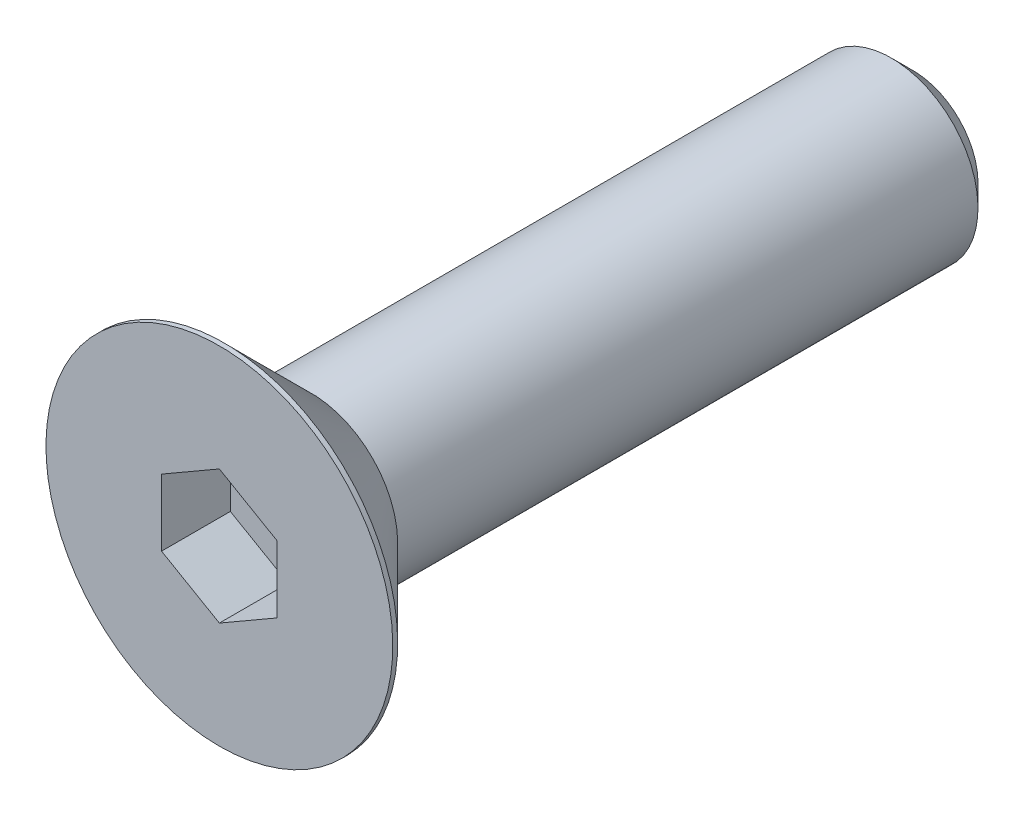
ISO-10303-21;
HEADER;
FILE_DESCRIPTION(('STEP AP214'),'2;1');
FILE_NAME('part.step','',(''),(''),'','','');
FILE_SCHEMA(('AUTOMOTIVE_DESIGN { 1 0 10303 214 1 1 1 1 }'));
ENDSEC;
DATA;
#1=APPLICATION_CONTEXT('core data for automotive mechanical design processes');
#2=APPLICATION_PROTOCOL_DEFINITION('international standard','automotive_design',2000,#1);
#3=PRODUCT_CONTEXT('',#1,'mechanical');
#4=PRODUCT('Part','Part','',(#3));
#5=PRODUCT_RELATED_PRODUCT_CATEGORY('part','',(#4));
#6=PRODUCT_DEFINITION_FORMATION('','',#4);
#7=PRODUCT_DEFINITION_CONTEXT('part definition',#1,'design');
#8=PRODUCT_DEFINITION('design','',#6,#7);
#9=PRODUCT_DEFINITION_SHAPE('','',#8);
#10=(LENGTH_UNIT() NAMED_UNIT(*) SI_UNIT(.MILLI.,.METRE.));
#11=(NAMED_UNIT(*) PLANE_ANGLE_UNIT() SI_UNIT($,.RADIAN.));
#12=(NAMED_UNIT(*) SI_UNIT($,.STERADIAN.) SOLID_ANGLE_UNIT());
#13=UNCERTAINTY_MEASURE_WITH_UNIT(LENGTH_MEASURE(1.E-05),#10,'distance_accuracy_value','');
#14=(GEOMETRIC_REPRESENTATION_CONTEXT(3) GLOBAL_UNCERTAINTY_ASSIGNED_CONTEXT((#13)) GLOBAL_UNIT_ASSIGNED_CONTEXT((#10,
#11,#12)) REPRESENTATION_CONTEXT('',''));
#15=CARTESIAN_POINT('',(0.,0.,0.));
#16=DIRECTION('',(0.,0.,1.));
#17=DIRECTION('',(1.,0.,0.));
#18=AXIS2_PLACEMENT_3D('',#15,#16,#17);
#19=CARTESIAN_POINT('',(0.,0.,5.915));
#20=DIRECTION('',(0.,0.,1.));
#21=DIRECTION('',(0.,-1.,0.));
#22=AXIS2_PLACEMENT_3D('',#19,#20,#21);
#23=CONICAL_SURFACE('',#22,3.,0.785398163397448);
#24=CARTESIAN_POINT('',(0.,0.,4.3));
#25=DIRECTION('',(0.,0.,1.));
#26=DIRECTION('',(0.,-1.,0.));
#27=AXIS2_PLACEMENT_3D('',#24,#25,#26);
#28=CIRCLE('',#27,1.385);
#29=CARTESIAN_POINT('',(0.,-1.385,4.3));
#30=VERTEX_POINT('',#29);
#31=EDGE_CURVE('E150',#30,#30,#28,.T.);
#32=ORIENTED_EDGE('',*,*,#31,.T.);
#33=EDGE_LOOP('',(#32));
#34=FACE_BOUND('',#33,.T.);
#35=CARTESIAN_POINT('',(0.,0.,5.915));
#36=DIRECTION('',(0.,0.,1.));
#37=DIRECTION('',(0.,-1.,0.));
#38=AXIS2_PLACEMENT_3D('',#35,#36,#37);
#39=CIRCLE('',#38,3.);
#40=CARTESIAN_POINT('',(0.,-3.,5.915));
#41=VERTEX_POINT('',#40);
#42=EDGE_CURVE('E12',#41,#41,#39,.T.);
#43=ORIENTED_EDGE('',*,*,#42,.F.);
#44=EDGE_LOOP('',(#43));
#45=FACE_BOUND('',#44,.T.);
#46=ADVANCED_FACE('F49',(#34,#45),#23,.T.);
#47=CARTESIAN_POINT('',(0.,0.,6.));
#48=DIRECTION('',(0.,0.,1.));
#49=DIRECTION('',(0.,-1.,0.));
#50=AXIS2_PLACEMENT_3D('',#47,#48,#49);
#51=CYLINDRICAL_SURFACE('',#50,3.);
#52=ORIENTED_EDGE('',*,*,#42,.T.);
#53=EDGE_LOOP('',(#52));
#54=FACE_BOUND('',#53,.T.);
#55=CARTESIAN_POINT('',(0.,0.,6.));
#56=DIRECTION('',(0.,0.,1.));
#57=DIRECTION('',(0.,-1.,0.));
#58=AXIS2_PLACEMENT_3D('',#55,#56,#57);
#59=CIRCLE('',#58,3.);
#60=CARTESIAN_POINT('',(0.,-3.,6.));
#61=VERTEX_POINT('',#60);
#62=EDGE_CURVE('E56',#61,#61,#59,.T.);
#63=ORIENTED_EDGE('',*,*,#62,.F.);
#64=EDGE_LOOP('',(#63));
#65=FACE_BOUND('',#64,.T.);
#66=ADVANCED_FACE('F162',(#54,#65),#51,.T.);
#67=CARTESIAN_POINT('',(0.,0.,6.));
#68=DIRECTION('',(0.,0.,-1.));
#69=DIRECTION('',(0.,1.,0.));
#70=AXIS2_PLACEMENT_3D('',#67,#68,#69);
#71=PLANE('',#70);
#72=DIRECTION('',(0.,1.,0.));
#73=VECTOR('',#72,1.);
#74=CARTESIAN_POINT('',(1.,-0.577350269189627,6.));
#75=LINE('',#74,#73);
#76=CARTESIAN_POINT('',(1.,-0.577350269189627,6.));
#77=VERTEX_POINT('',#76);
#78=CARTESIAN_POINT('',(1.,0.577350269189625,6.));
#79=VERTEX_POINT('',#78);
#80=EDGE_CURVE('E137',#77,#79,#75,.T.);
#81=ORIENTED_EDGE('',*,*,#80,.F.);
#82=DIRECTION('',(0.866025403784438,0.5,0.));
#83=VECTOR('',#82,1.);
#84=CARTESIAN_POINT('',(0.,-1.15470053837926,6.));
#85=LINE('',#84,#83);
#86=CARTESIAN_POINT('',(0.,-1.15470053837926,6.));
#87=VERTEX_POINT('',#86);
#88=EDGE_CURVE('E63',#87,#77,#85,.T.);
#89=ORIENTED_EDGE('',*,*,#88,.F.);
#90=DIRECTION('',(0.866025403784439,-0.5,0.));
#91=VECTOR('',#90,1.);
#92=CARTESIAN_POINT('',(-1.,-0.577350269189629,6.));
#93=LINE('',#92,#91);
#94=CARTESIAN_POINT('',(-1.,-0.577350269189629,6.));
#95=VERTEX_POINT('',#94);
#96=EDGE_CURVE('E146',#95,#87,#93,.T.);
#97=ORIENTED_EDGE('',*,*,#96,.F.);
#98=DIRECTION('',(0.,-1.,0.));
#99=VECTOR('',#98,1.);
#100=CARTESIAN_POINT('',(-1.,0.577350269189624,6.));
#101=LINE('',#100,#99);
#102=CARTESIAN_POINT('',(-1.,0.577350269189624,6.));
#103=VERTEX_POINT('',#102);
#104=EDGE_CURVE('E144',#103,#95,#101,.T.);
#105=ORIENTED_EDGE('',*,*,#104,.F.);
#106=DIRECTION('',(-0.866025403784438,-0.5,0.));
#107=VECTOR('',#106,1.);
#108=CARTESIAN_POINT('',(0.,1.15470053837925,6.));
#109=LINE('',#108,#107);
#110=CARTESIAN_POINT('',(0.,1.15470053837925,6.));
#111=VERTEX_POINT('',#110);
#112=EDGE_CURVE('E111',#111,#103,#109,.T.);
#113=ORIENTED_EDGE('',*,*,#112,.F.);
#114=DIRECTION('',(-0.866025403784439,0.5,0.));
#115=VECTOR('',#114,1.);
#116=CARTESIAN_POINT('',(1.,0.577350269189625,6.));
#117=LINE('',#116,#115);
#118=EDGE_CURVE('E140',#79,#111,#117,.T.);
#119=ORIENTED_EDGE('',*,*,#118,.F.);
#120=EDGE_LOOP('',(#81,#89,#97,#105,#113,#119));
#121=FACE_BOUND('',#120,.T.);
#122=ORIENTED_EDGE('',*,*,#62,.T.);
#123=EDGE_LOOP('',(#122));
#124=FACE_BOUND('',#123,.T.);
#125=ADVANCED_FACE('F160',(#121,#124),#71,.F.);
#126=CARTESIAN_POINT('',(0.,0.,4.3));
#127=DIRECTION('',(0.,0.,-1.));
#128=DIRECTION('',(0.,1.,0.));
#129=AXIS2_PLACEMENT_3D('',#126,#127,#128);
#130=PLANE('',#129);
#131=ORIENTED_EDGE('',*,*,#31,.F.);
#132=EDGE_LOOP('',(#131));
#133=FACE_BOUND('',#132,.T.);
#134=ADVANCED_FACE('F169',(#133),#130,.T.);
#135=CARTESIAN_POINT('',(0.,-1.15470053837926,4.81));
#136=DIRECTION('',(0.5,-0.866025403784438,0.));
#137=DIRECTION('',(0.866025403784439,0.5,0.));
#138=AXIS2_PLACEMENT_3D('',#135,#136,#137);
#139=PLANE('',#138);
#140=ORIENTED_EDGE('',*,*,#88,.T.);
#141=DIRECTION('',(0.,0.,1.));
#142=VECTOR('',#141,1.);
#143=CARTESIAN_POINT('',(1.,-0.577350269189627,4.81));
#144=LINE('',#143,#142);
#145=CARTESIAN_POINT('',(1.,-0.577350269189627,4.81));
#146=VERTEX_POINT('',#145);
#147=EDGE_CURVE('E93',#146,#77,#144,.T.);
#148=ORIENTED_EDGE('',*,*,#147,.F.);
#149=DIRECTION('',(0.866025403784438,0.5,0.));
#150=VECTOR('',#149,1.);
#151=CARTESIAN_POINT('',(0.,-1.15470053837926,4.81));
#152=LINE('',#151,#150);
#153=CARTESIAN_POINT('',(0.,-1.15470053837926,4.81));
#154=VERTEX_POINT('',#153);
#155=EDGE_CURVE('E148',#154,#146,#152,.T.);
#156=ORIENTED_EDGE('',*,*,#155,.F.);
#157=DIRECTION('',(0.,0.,1.));
#158=VECTOR('',#157,1.);
#159=CARTESIAN_POINT('',(0.,-1.15470053837926,4.81));
#160=LINE('',#159,#158);
#161=EDGE_CURVE('E71',#154,#87,#160,.T.);
#162=ORIENTED_EDGE('',*,*,#161,.T.);
#163=EDGE_LOOP('',(#140,#148,#156,#162));
#164=FACE_BOUND('',#163,.T.);
#165=ADVANCED_FACE('F176',(#164),#139,.F.);
#166=CARTESIAN_POINT('',(-1.,-0.577350269189629,4.81));
#167=DIRECTION('',(-0.5,-0.866025403784439,0.));
#168=DIRECTION('',(0.866025403784439,-0.5,0.));
#169=AXIS2_PLACEMENT_3D('',#166,#167,#168);
#170=PLANE('',#169);
#171=ORIENTED_EDGE('',*,*,#96,.T.);
#172=ORIENTED_EDGE('',*,*,#161,.F.);
#173=DIRECTION('',(0.866025403784439,-0.5,0.));
#174=VECTOR('',#173,1.);
#175=CARTESIAN_POINT('',(-1.,-0.577350269189629,4.81));
#176=LINE('',#175,#174);
#177=CARTESIAN_POINT('',(-1.,-0.577350269189629,4.81));
#178=VERTEX_POINT('',#177);
#179=EDGE_CURVE('E123',#178,#154,#176,.T.);
#180=ORIENTED_EDGE('',*,*,#179,.F.);
#181=DIRECTION('',(0.,0.,1.));
#182=VECTOR('',#181,1.);
#183=CARTESIAN_POINT('',(-1.,-0.577350269189629,4.81));
#184=LINE('',#183,#182);
#185=EDGE_CURVE('E115',#178,#95,#184,.T.);
#186=ORIENTED_EDGE('',*,*,#185,.T.);
#187=EDGE_LOOP('',(#171,#172,#180,#186));
#188=FACE_BOUND('',#187,.T.);
#189=ADVANCED_FACE('F180',(#188),#170,.F.);
#190=CARTESIAN_POINT('',(-1.,0.577350269189624,4.81));
#191=DIRECTION('',(-1.,0.,0.));
#192=DIRECTION('',(0.,-1.,0.));
#193=AXIS2_PLACEMENT_3D('',#190,#191,#192);
#194=PLANE('',#193);
#195=ORIENTED_EDGE('',*,*,#104,.T.);
#196=ORIENTED_EDGE('',*,*,#185,.F.);
#197=DIRECTION('',(0.,-1.,0.));
#198=VECTOR('',#197,1.);
#199=CARTESIAN_POINT('',(-1.,0.577350269189624,4.81));
#200=LINE('',#199,#198);
#201=CARTESIAN_POINT('',(-1.,0.577350269189624,4.81));
#202=VERTEX_POINT('',#201);
#203=EDGE_CURVE('E119',#202,#178,#200,.T.);
#204=ORIENTED_EDGE('',*,*,#203,.F.);
#205=DIRECTION('',(0.,0.,1.));
#206=VECTOR('',#205,1.);
#207=CARTESIAN_POINT('',(-1.,0.577350269189624,4.81));
#208=LINE('',#207,#206);
#209=EDGE_CURVE('E104',#202,#103,#208,.T.);
#210=ORIENTED_EDGE('',*,*,#209,.T.);
#211=EDGE_LOOP('',(#195,#196,#204,#210));
#212=FACE_BOUND('',#211,.T.);
#213=ADVANCED_FACE('F120',(#212),#194,.F.);
#214=CARTESIAN_POINT('',(0.,1.15470053837925,4.81));
#215=DIRECTION('',(-0.5,0.866025403784439,0.));
#216=DIRECTION('',(-0.866025403784439,-0.5,0.));
#217=AXIS2_PLACEMENT_3D('',#214,#215,#216);
#218=PLANE('',#217);
#219=ORIENTED_EDGE('',*,*,#112,.T.);
#220=ORIENTED_EDGE('',*,*,#209,.F.);
#221=DIRECTION('',(-0.866025403784438,-0.5,0.));
#222=VECTOR('',#221,1.);
#223=CARTESIAN_POINT('',(0.,1.15470053837925,4.81));
#224=LINE('',#223,#222);
#225=CARTESIAN_POINT('',(0.,1.15470053837925,4.81));
#226=VERTEX_POINT('',#225);
#227=EDGE_CURVE('E108',#226,#202,#224,.T.);
#228=ORIENTED_EDGE('',*,*,#227,.F.);
#229=DIRECTION('',(0.,0.,1.));
#230=VECTOR('',#229,1.);
#231=CARTESIAN_POINT('',(0.,1.15470053837925,4.81));
#232=LINE('',#231,#230);
#233=EDGE_CURVE('E116',#226,#111,#232,.T.);
#234=ORIENTED_EDGE('',*,*,#233,.T.);
#235=EDGE_LOOP('',(#219,#220,#228,#234));
#236=FACE_BOUND('',#235,.T.);
#237=ADVANCED_FACE('F106',(#236),#218,.F.);
#238=CARTESIAN_POINT('',(1.,0.577350269189625,4.81));
#239=DIRECTION('',(0.5,0.866025403784439,0.));
#240=DIRECTION('',(-0.866025403784439,0.5,0.));
#241=AXIS2_PLACEMENT_3D('',#238,#239,#240);
#242=PLANE('',#241);
#243=ORIENTED_EDGE('',*,*,#118,.T.);
#244=ORIENTED_EDGE('',*,*,#233,.F.);
#245=DIRECTION('',(-0.866025403784439,0.5,0.));
#246=VECTOR('',#245,1.);
#247=CARTESIAN_POINT('',(1.,0.577350269189625,4.81));
#248=LINE('',#247,#246);
#249=CARTESIAN_POINT('',(1.,0.577350269189625,4.81));
#250=VERTEX_POINT('',#249);
#251=EDGE_CURVE('E129',#250,#226,#248,.T.);
#252=ORIENTED_EDGE('',*,*,#251,.F.);
#253=DIRECTION('',(0.,0.,1.));
#254=VECTOR('',#253,1.);
#255=CARTESIAN_POINT('',(1.,0.577350269189625,4.81));
#256=LINE('',#255,#254);
#257=EDGE_CURVE('E153',#250,#79,#256,.T.);
#258=ORIENTED_EDGE('',*,*,#257,.T.);
#259=EDGE_LOOP('',(#243,#244,#252,#258));
#260=FACE_BOUND('',#259,.T.);
#261=ADVANCED_FACE('F184',(#260),#242,.F.);
#262=CARTESIAN_POINT('',(1.,-0.577350269189627,4.81));
#263=DIRECTION('',(1.,0.,0.));
#264=DIRECTION('',(0.,1.,0.));
#265=AXIS2_PLACEMENT_3D('',#262,#263,#264);
#266=PLANE('',#265);
#267=ORIENTED_EDGE('',*,*,#80,.T.);
#268=ORIENTED_EDGE('',*,*,#257,.F.);
#269=DIRECTION('',(0.,1.,0.));
#270=VECTOR('',#269,1.);
#271=CARTESIAN_POINT('',(1.,-0.577350269189627,4.81));
#272=LINE('',#271,#270);
#273=EDGE_CURVE('E131',#146,#250,#272,.T.);
#274=ORIENTED_EDGE('',*,*,#273,.F.);
#275=ORIENTED_EDGE('',*,*,#147,.T.);
#276=EDGE_LOOP('',(#267,#268,#274,#275));
#277=FACE_BOUND('',#276,.T.);
#278=ADVANCED_FACE('F181',(#277),#266,.F.);
#279=CARTESIAN_POINT('',(1.,-0.577350269189627,4.81));
#280=DIRECTION('',(0.,0.,1.));
#281=DIRECTION('',(1.,0.,0.));
#282=AXIS2_PLACEMENT_3D('',#279,#280,#281);
#283=PLANE('',#282);
#284=ORIENTED_EDGE('',*,*,#155,.T.);
#285=ORIENTED_EDGE('',*,*,#273,.T.);
#286=ORIENTED_EDGE('',*,*,#251,.T.);
#287=ORIENTED_EDGE('',*,*,#227,.T.);
#288=ORIENTED_EDGE('',*,*,#203,.T.);
#289=ORIENTED_EDGE('',*,*,#179,.T.);
#290=EDGE_LOOP('',(#284,#285,#286,#287,#288,#289));
#291=FACE_BOUND('',#290,.T.);
#292=ADVANCED_FACE('F126',(#291),#283,.T.);
#293=CLOSED_SHELL('',(#46,#66,#125,#134,#165,#189,#213,#237,#261,#278,#292));
#294=MANIFOLD_SOLID_BREP('B2',#293);
#295=CARTESIAN_POINT('',(0.,-1.50000000000001,4.81));
#296=DIRECTION('',(0.,0.,-1.));
#297=DIRECTION('',(0.,1.,0.));
#298=AXIS2_PLACEMENT_3D('',#295,#296,#297);
#299=PLANE('',#298);
#300=CARTESIAN_POINT('',(0.,0.,4.81000000000001));
#301=DIRECTION('',(0.,0.,1.));
#302=DIRECTION('',(0.,-1.,0.));
#303=AXIS2_PLACEMENT_3D('',#300,#301,#302);
#304=CIRCLE('',#303,1.50000000000001);
#305=CARTESIAN_POINT('',(0.,-1.50000000000001,4.81000000000001));
#306=VERTEX_POINT('',#305);
#307=EDGE_CURVE('E283',#306,#306,#304,.T.);
#308=ORIENTED_EDGE('',*,*,#307,.T.);
#309=EDGE_LOOP('',(#308));
#310=FACE_BOUND('',#309,.T.);
#311=ADVANCED_FACE('F270',(#310),#299,.F.);
#312=CARTESIAN_POINT('',(0.,-1.5,-6.00000000000001));
#313=DIRECTION('',(0.,0.,1.));
#314=DIRECTION('',(0.,-1.,0.));
#315=AXIS2_PLACEMENT_3D('',#312,#313,#314);
#316=PLANE('',#315);
#317=CARTESIAN_POINT('',(0.,0.,-6.00000000000001));
#318=DIRECTION('',(0.,0.,1.));
#319=DIRECTION('',(0.,-1.,0.));
#320=AXIS2_PLACEMENT_3D('',#317,#318,#319);
#321=CIRCLE('',#320,1.125);
#322=CARTESIAN_POINT('',(0.,-1.125,-6.00000000000001));
#323=VERTEX_POINT('',#322);
#324=EDGE_CURVE('E48',#323,#323,#321,.F.);
#325=ORIENTED_EDGE('',*,*,#324,.T.);
#326=EDGE_LOOP('',(#325));
#327=FACE_BOUND('',#326,.T.);
#328=ADVANCED_FACE('F294',(#327),#316,.F.);
#329=CARTESIAN_POINT('',(0.,0.,4.81));
#330=DIRECTION('',(0.,0.,1.));
#331=DIRECTION('',(0.,-1.,0.));
#332=AXIS2_PLACEMENT_3D('',#329,#330,#331);
#333=CYLINDRICAL_SURFACE('',#332,1.50000000000001);
#334=CARTESIAN_POINT('',(0.,0.,-5.625));
#335=DIRECTION('',(0.,0.,1.));
#336=DIRECTION('',(0.,-1.,0.));
#337=AXIS2_PLACEMENT_3D('',#334,#335,#336);
#338=CIRCLE('',#337,1.50000000000001);
#339=CARTESIAN_POINT('',(0.,-1.50000000000001,-5.625));
#340=VERTEX_POINT('',#339);
#341=EDGE_CURVE('E278',#340,#340,#338,.T.);
#342=ORIENTED_EDGE('',*,*,#341,.T.);
#343=EDGE_LOOP('',(#342));
#344=FACE_BOUND('',#343,.T.);
#345=ORIENTED_EDGE('',*,*,#307,.F.);
#346=EDGE_LOOP('',(#345));
#347=FACE_BOUND('',#346,.T.);
#348=ADVANCED_FACE('F292',(#344,#347),#333,.T.);
#349=CARTESIAN_POINT('',(0.,0.,-5.625));
#350=DIRECTION('',(0.,0.,1.));
#351=DIRECTION('',(0.,-1.,0.));
#352=AXIS2_PLACEMENT_3D('',#349,#350,#351);
#353=CONICAL_SURFACE('',#352,1.50000000000001,0.785398163397452);
#354=ORIENTED_EDGE('',*,*,#324,.F.);
#355=EDGE_LOOP('',(#354));
#356=FACE_BOUND('',#355,.T.);
#357=ORIENTED_EDGE('',*,*,#341,.F.);
#358=EDGE_LOOP('',(#357));
#359=FACE_BOUND('',#358,.T.);
#360=ADVANCED_FACE('F272',(#356,#359),#353,.T.);
#361=CLOSED_SHELL('',(#311,#328,#348,#360));
#362=MANIFOLD_SOLID_BREP('B6',#361);
#363=ADVANCED_BREP_SHAPE_REPRESENTATION('',(#18,#294,#362),#14);
#364=SHAPE_DEFINITION_REPRESENTATION(#9,#363);
ENDSEC;
END-ISO-10303-21;
